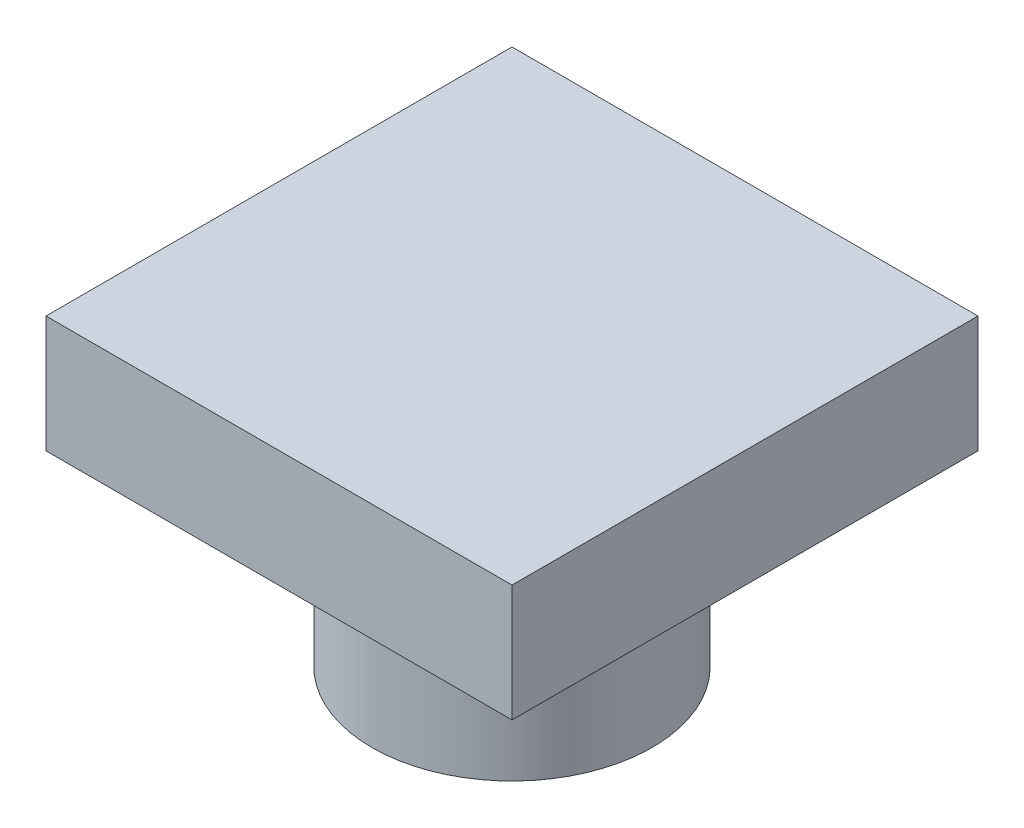
ISO-10303-21;
HEADER;
FILE_DESCRIPTION(('STEP AP214'),'2;1');
FILE_NAME('part.step','',(''),(''),'','','');
FILE_SCHEMA(('AUTOMOTIVE_DESIGN { 1 0 10303 214 1 1 1 1 }'));
ENDSEC;
DATA;
#1=APPLICATION_CONTEXT('core data for automotive mechanical design processes');
#2=APPLICATION_PROTOCOL_DEFINITION('international standard','automotive_design',2000,#1);
#3=PRODUCT_CONTEXT('',#1,'mechanical');
#4=PRODUCT('Part','Part','',(#3));
#5=PRODUCT_RELATED_PRODUCT_CATEGORY('part','',(#4));
#6=PRODUCT_DEFINITION_FORMATION('','',#4);
#7=PRODUCT_DEFINITION_CONTEXT('part definition',#1,'design');
#8=PRODUCT_DEFINITION('design','',#6,#7);
#9=PRODUCT_DEFINITION_SHAPE('','',#8);
#10=(LENGTH_UNIT() NAMED_UNIT(*) SI_UNIT(.MILLI.,.METRE.));
#11=(NAMED_UNIT(*) PLANE_ANGLE_UNIT() SI_UNIT($,.RADIAN.));
#12=(NAMED_UNIT(*) SI_UNIT($,.STERADIAN.) SOLID_ANGLE_UNIT());
#13=UNCERTAINTY_MEASURE_WITH_UNIT(LENGTH_MEASURE(1.E-05),#10,'distance_accuracy_value','');
#14=(GEOMETRIC_REPRESENTATION_CONTEXT(3) GLOBAL_UNCERTAINTY_ASSIGNED_CONTEXT((#13)) GLOBAL_UNIT_ASSIGNED_CONTEXT((#10,
#11,#12)) REPRESENTATION_CONTEXT('',''));
#15=CARTESIAN_POINT('',(0.,0.,0.));
#16=DIRECTION('',(0.,0.,1.));
#17=DIRECTION('',(1.,0.,0.));
#18=AXIS2_PLACEMENT_3D('',#15,#16,#17);
#19=CARTESIAN_POINT('',(0.,0.,0.));
#20=DIRECTION('',(0.,1.,0.));
#21=DIRECTION('',(0.,0.,1.));
#22=AXIS2_PLACEMENT_3D('',#19,#20,#21);
#23=PLANE('',#22);
#24=CARTESIAN_POINT('',(0.,0.,0.));
#25=DIRECTION('',(0.,-1.,0.));
#26=DIRECTION('',(0.,0.,-1.));
#27=AXIS2_PLACEMENT_3D('',#24,#25,#26);
#28=CIRCLE('',#27,4.);
#29=CARTESIAN_POINT('',(0.,0.,-4.));
#30=VERTEX_POINT('',#29);
#31=EDGE_CURVE('E144',#30,#30,#28,.T.);
#32=ORIENTED_EDGE('',*,*,#31,.F.);
#33=EDGE_LOOP('',(#32));
#34=FACE_BOUND('',#33,.T.);
#35=CARTESIAN_POINT('',(0.,0.,0.));
#36=DIRECTION('',(0.,-1.,0.));
#37=DIRECTION('',(0.,0.,-1.));
#38=AXIS2_PLACEMENT_3D('',#35,#36,#37);
#39=CIRCLE('',#38,6.);
#40=CARTESIAN_POINT('',(0.,0.,-6.));
#41=VERTEX_POINT('',#40);
#42=EDGE_CURVE('E11',#41,#41,#39,.T.);
#43=ORIENTED_EDGE('',*,*,#42,.T.);
#44=EDGE_LOOP('',(#43));
#45=FACE_BOUND('',#44,.T.);
#46=ADVANCED_FACE('F37',(#34,#45),#23,.F.);
#47=CARTESIAN_POINT('',(0.,0.,0.));
#48=DIRECTION('',(0.,-1.,0.));
#49=DIRECTION('',(0.,0.,-1.));
#50=AXIS2_PLACEMENT_3D('',#47,#48,#49);
#51=CYLINDRICAL_SURFACE('',#50,6.);
#52=ORIENTED_EDGE('',*,*,#42,.F.);
#53=EDGE_LOOP('',(#52));
#54=FACE_BOUND('',#53,.T.);
#55=CARTESIAN_POINT('',(0.,8.,0.));
#56=DIRECTION('',(0.,-1.,0.));
#57=DIRECTION('',(0.,0.,-1.));
#58=AXIS2_PLACEMENT_3D('',#55,#56,#57);
#59=CIRCLE('',#58,6.);
#60=CARTESIAN_POINT('',(0.,8.,-6.));
#61=VERTEX_POINT('',#60);
#62=EDGE_CURVE('E45',#61,#61,#59,.T.);
#63=ORIENTED_EDGE('',*,*,#62,.T.);
#64=EDGE_LOOP('',(#63));
#65=FACE_BOUND('',#64,.T.);
#66=ADVANCED_FACE('F119',(#54,#65),#51,.T.);
#67=CARTESIAN_POINT('',(-9.975,13.,9.975));
#68=DIRECTION('',(-1.,0.,0.));
#69=DIRECTION('',(0.,0.,1.));
#70=AXIS2_PLACEMENT_3D('',#67,#68,#69);
#71=PLANE('',#70);
#72=DIRECTION('',(0.,0.,-1.));
#73=VECTOR('',#72,1.);
#74=CARTESIAN_POINT('',(-9.975,8.,9.975));
#75=LINE('',#74,#73);
#76=CARTESIAN_POINT('',(-9.975,8.,9.975));
#77=VERTEX_POINT('',#76);
#78=CARTESIAN_POINT('',(-9.975,8.,-9.975));
#79=VERTEX_POINT('',#78);
#80=EDGE_CURVE('E106',#77,#79,#75,.T.);
#81=ORIENTED_EDGE('',*,*,#80,.F.);
#82=DIRECTION('',(0.,-1.,0.));
#83=VECTOR('',#82,1.);
#84=CARTESIAN_POINT('',(-9.975,13.,9.975));
#85=LINE('',#84,#83);
#86=CARTESIAN_POINT('',(-9.975,13.,9.975));
#87=VERTEX_POINT('',#86);
#88=EDGE_CURVE('E53',#87,#77,#85,.T.);
#89=ORIENTED_EDGE('',*,*,#88,.F.);
#90=DIRECTION('',(0.,0.,-1.));
#91=VECTOR('',#90,1.);
#92=CARTESIAN_POINT('',(-9.975,13.,9.975));
#93=LINE('',#92,#91);
#94=CARTESIAN_POINT('',(-9.975,13.,-9.975));
#95=VERTEX_POINT('',#94);
#96=EDGE_CURVE('E100',#87,#95,#93,.T.);
#97=ORIENTED_EDGE('',*,*,#96,.T.);
#98=DIRECTION('',(0.,-1.,0.));
#99=VECTOR('',#98,1.);
#100=CARTESIAN_POINT('',(-9.975,13.,-9.975));
#101=LINE('',#100,#99);
#102=EDGE_CURVE('E78',#95,#79,#101,.T.);
#103=ORIENTED_EDGE('',*,*,#102,.T.);
#104=EDGE_LOOP('',(#81,#89,#97,#103));
#105=FACE_BOUND('',#104,.T.);
#106=ADVANCED_FACE('F126',(#105),#71,.T.);
#107=CARTESIAN_POINT('',(-9.975,13.,9.975));
#108=DIRECTION('',(0.,0.,-1.));
#109=DIRECTION('',(-1.,0.,0.));
#110=AXIS2_PLACEMENT_3D('',#107,#108,#109);
#111=PLANE('',#110);
#112=DIRECTION('',(1.,0.,0.));
#113=VECTOR('',#112,1.);
#114=CARTESIAN_POINT('',(-9.975,8.,9.975));
#115=LINE('',#114,#113);
#116=CARTESIAN_POINT('',(9.975,8.,9.975));
#117=VERTEX_POINT('',#116);
#118=EDGE_CURVE('E70',#77,#117,#115,.T.);
#119=ORIENTED_EDGE('',*,*,#118,.T.);
#120=DIRECTION('',(0.,-1.,0.));
#121=VECTOR('',#120,1.);
#122=CARTESIAN_POINT('',(9.975,13.,9.975));
#123=LINE('',#122,#121);
#124=CARTESIAN_POINT('',(9.975,13.,9.975));
#125=VERTEX_POINT('',#124);
#126=EDGE_CURVE('E97',#125,#117,#123,.T.);
#127=ORIENTED_EDGE('',*,*,#126,.F.);
#128=DIRECTION('',(1.,0.,0.));
#129=VECTOR('',#128,1.);
#130=CARTESIAN_POINT('',(-9.975,13.,9.975));
#131=LINE('',#130,#129);
#132=EDGE_CURVE('E88',#87,#125,#131,.T.);
#133=ORIENTED_EDGE('',*,*,#132,.F.);
#134=ORIENTED_EDGE('',*,*,#88,.T.);
#135=EDGE_LOOP('',(#119,#127,#133,#134));
#136=FACE_BOUND('',#135,.T.);
#137=ADVANCED_FACE('F128',(#136),#111,.F.);
#138=CARTESIAN_POINT('',(9.975,13.,9.975));
#139=DIRECTION('',(-1.,0.,0.));
#140=DIRECTION('',(0.,0.,1.));
#141=AXIS2_PLACEMENT_3D('',#138,#139,#140);
#142=PLANE('',#141);
#143=DIRECTION('',(0.,0.,-1.));
#144=VECTOR('',#143,1.);
#145=CARTESIAN_POINT('',(9.975,8.,9.975));
#146=LINE('',#145,#144);
#147=CARTESIAN_POINT('',(9.975,8.,-9.975));
#148=VERTEX_POINT('',#147);
#149=EDGE_CURVE('E95',#117,#148,#146,.T.);
#150=ORIENTED_EDGE('',*,*,#149,.T.);
#151=DIRECTION('',(0.,-1.,0.));
#152=VECTOR('',#151,1.);
#153=CARTESIAN_POINT('',(9.975,13.,-9.975));
#154=LINE('',#153,#152);
#155=CARTESIAN_POINT('',(9.975,13.,-9.975));
#156=VERTEX_POINT('',#155);
#157=EDGE_CURVE('E92',#156,#148,#154,.T.);
#158=ORIENTED_EDGE('',*,*,#157,.F.);
#159=DIRECTION('',(0.,0.,-1.));
#160=VECTOR('',#159,1.);
#161=CARTESIAN_POINT('',(9.975,13.,9.975));
#162=LINE('',#161,#160);
#163=EDGE_CURVE('E83',#125,#156,#162,.T.);
#164=ORIENTED_EDGE('',*,*,#163,.F.);
#165=ORIENTED_EDGE('',*,*,#126,.T.);
#166=EDGE_LOOP('',(#150,#158,#164,#165));
#167=FACE_BOUND('',#166,.T.);
#168=ADVANCED_FACE('F93',(#167),#142,.F.);
#169=CARTESIAN_POINT('',(-9.975,13.,-9.975));
#170=DIRECTION('',(0.,0.,-1.));
#171=DIRECTION('',(-1.,0.,0.));
#172=AXIS2_PLACEMENT_3D('',#169,#170,#171);
#173=PLANE('',#172);
#174=DIRECTION('',(1.,0.,0.));
#175=VECTOR('',#174,1.);
#176=CARTESIAN_POINT('',(-9.975,8.,-9.975));
#177=LINE('',#176,#175);
#178=EDGE_CURVE('E109',#79,#148,#177,.T.);
#179=ORIENTED_EDGE('',*,*,#178,.F.);
#180=ORIENTED_EDGE('',*,*,#102,.F.);
#181=DIRECTION('',(1.,0.,0.));
#182=VECTOR('',#181,1.);
#183=CARTESIAN_POINT('',(-9.975,13.,-9.975));
#184=LINE('',#183,#182);
#185=EDGE_CURVE('E87',#95,#156,#184,.T.);
#186=ORIENTED_EDGE('',*,*,#185,.T.);
#187=ORIENTED_EDGE('',*,*,#157,.T.);
#188=EDGE_LOOP('',(#179,#180,#186,#187));
#189=FACE_BOUND('',#188,.T.);
#190=ADVANCED_FACE('F99',(#189),#173,.T.);
#191=CARTESIAN_POINT('',(0.,13.,0.));
#192=DIRECTION('',(0.,-1.,0.));
#193=DIRECTION('',(0.,0.,-1.));
#194=AXIS2_PLACEMENT_3D('',#191,#192,#193);
#195=PLANE('',#194);
#196=ORIENTED_EDGE('',*,*,#96,.F.);
#197=ORIENTED_EDGE('',*,*,#132,.T.);
#198=ORIENTED_EDGE('',*,*,#163,.T.);
#199=ORIENTED_EDGE('',*,*,#185,.F.);
#200=EDGE_LOOP('',(#196,#197,#198,#199));
#201=FACE_BOUND('',#200,.T.);
#202=ADVANCED_FACE('F86',(#201),#195,.F.);
#203=CARTESIAN_POINT('',(0.,8.,0.));
#204=DIRECTION('',(0.,-1.,0.));
#205=DIRECTION('',(0.,0.,-1.));
#206=AXIS2_PLACEMENT_3D('',#203,#204,#205);
#207=PLANE('',#206);
#208=ORIENTED_EDGE('',*,*,#62,.F.);
#209=EDGE_LOOP('',(#208));
#210=FACE_BOUND('',#209,.T.);
#211=ORIENTED_EDGE('',*,*,#80,.T.);
#212=ORIENTED_EDGE('',*,*,#178,.T.);
#213=ORIENTED_EDGE('',*,*,#149,.F.);
#214=ORIENTED_EDGE('',*,*,#118,.F.);
#215=EDGE_LOOP('',(#211,#212,#213,#214));
#216=FACE_BOUND('',#215,.T.);
#217=ADVANCED_FACE('F121',(#210,#216),#207,.T.);
#218=CARTESIAN_POINT('',(0.,10.5,0.));
#219=DIRECTION('',(0.,-1.,0.));
#220=DIRECTION('',(0.,0.,-1.));
#221=AXIS2_PLACEMENT_3D('',#218,#219,#220);
#222=CYLINDRICAL_SURFACE('',#221,4.);
#223=CARTESIAN_POINT('',(0.,10.5,0.));
#224=DIRECTION('',(0.,-1.,0.));
#225=DIRECTION('',(0.,0.,-1.));
#226=AXIS2_PLACEMENT_3D('',#223,#224,#225);
#227=CIRCLE('',#226,4.);
#228=CARTESIAN_POINT('',(0.,10.5,-4.));
#229=VERTEX_POINT('',#228);
#230=EDGE_CURVE('E110',#229,#229,#227,.T.);
#231=CARTESIAN_POINT('',(0.,10.5,-4.));
#232=CARTESIAN_POINT('',(0.,10.390625,-4.));
#233=CARTESIAN_POINT('',(0.,10.28125,-4.));
#234=CARTESIAN_POINT('',(0.,10.0625,-4.));
#235=CARTESIAN_POINT('',(0.,9.953125,-4.));
#236=CARTESIAN_POINT('',(0.,9.734375,-4.));
#237=CARTESIAN_POINT('',(0.,9.625,-4.));
#238=CARTESIAN_POINT('',(0.,9.40625,-4.));
#239=CARTESIAN_POINT('',(0.,9.296875,-4.));
#240=CARTESIAN_POINT('',(0.,9.078125,-4.));
#241=CARTESIAN_POINT('',(0.,8.96875,-4.));
#242=CARTESIAN_POINT('',(0.,8.75,-4.));
#243=CARTESIAN_POINT('',(0.,8.640625,-4.));
#244=CARTESIAN_POINT('',(0.,8.421875,-4.));
#245=CARTESIAN_POINT('',(0.,8.3125,-4.));
#246=CARTESIAN_POINT('',(0.,8.09375,-4.));
#247=CARTESIAN_POINT('',(0.,7.984375,-4.));
#248=CARTESIAN_POINT('',(0.,7.765625,-4.));
#249=CARTESIAN_POINT('',(0.,7.65625,-4.));
#250=CARTESIAN_POINT('',(0.,7.4375,-4.));
#251=CARTESIAN_POINT('',(0.,7.328125,-4.));
#252=CARTESIAN_POINT('',(0.,7.109375,-4.));
#253=CARTESIAN_POINT('',(0.,7.,-4.));
#254=CARTESIAN_POINT('',(0.,6.78125,-4.));
#255=CARTESIAN_POINT('',(0.,6.671875,-4.));
#256=CARTESIAN_POINT('',(0.,6.453125,-4.));
#257=CARTESIAN_POINT('',(0.,6.34375,-4.));
#258=CARTESIAN_POINT('',(0.,6.125,-4.));
#259=CARTESIAN_POINT('',(0.,6.015625,-4.));
#260=CARTESIAN_POINT('',(0.,5.796875,-4.));
#261=CARTESIAN_POINT('',(0.,5.6875,-4.));
#262=CARTESIAN_POINT('',(0.,5.46875,-4.));
#263=CARTESIAN_POINT('',(0.,5.359375,-4.));
#264=CARTESIAN_POINT('',(0.,5.140625,-4.));
#265=CARTESIAN_POINT('',(0.,5.03125,-4.));
#266=CARTESIAN_POINT('',(0.,4.8125,-4.));
#267=CARTESIAN_POINT('',(0.,4.703125,-4.));
#268=CARTESIAN_POINT('',(0.,4.484375,-4.));
#269=CARTESIAN_POINT('',(0.,4.375,-4.));
#270=CARTESIAN_POINT('',(0.,4.15625,-4.));
#271=CARTESIAN_POINT('',(0.,4.046875,-4.));
#272=CARTESIAN_POINT('',(0.,3.828125,-4.));
#273=CARTESIAN_POINT('',(0.,3.71875,-4.));
#274=CARTESIAN_POINT('',(0.,3.5,-4.));
#275=CARTESIAN_POINT('',(0.,3.390625,-4.));
#276=CARTESIAN_POINT('',(0.,3.171875,-4.));
#277=CARTESIAN_POINT('',(0.,3.0625,-4.));
#278=CARTESIAN_POINT('',(0.,2.84375,-4.));
#279=CARTESIAN_POINT('',(0.,2.734375,-4.));
#280=CARTESIAN_POINT('',(0.,2.515625,-4.));
#281=CARTESIAN_POINT('',(0.,2.40625,-4.));
#282=CARTESIAN_POINT('',(0.,2.1875,-4.));
#283=CARTESIAN_POINT('',(0.,2.078125,-4.));
#284=CARTESIAN_POINT('',(0.,1.859375,-4.));
#285=CARTESIAN_POINT('',(0.,1.75,-4.));
#286=CARTESIAN_POINT('',(0.,1.53125,-4.));
#287=CARTESIAN_POINT('',(0.,1.421875,-4.));
#288=CARTESIAN_POINT('',(0.,1.203125,-4.));
#289=CARTESIAN_POINT('',(0.,1.09375,-4.));
#290=CARTESIAN_POINT('',(0.,0.875000000000001,-4.));
#291=CARTESIAN_POINT('',(0.,0.765625000000001,-4.));
#292=CARTESIAN_POINT('',(0.,0.546875,-4.));
#293=CARTESIAN_POINT('',(0.,0.4375,-4.));
#294=CARTESIAN_POINT('',(0.,0.21875,-4.));
#295=CARTESIAN_POINT('',(0.,0.109375,-4.));
#296=CARTESIAN_POINT('',(0.,0.,-4.));
#297=B_SPLINE_CURVE_WITH_KNOTS('',3,(#231,#232,#233,#234,#235,#236,#237,#238,#239,#240,#241,
#242,#243,#244,#245,#246,#247,#248,#249,#250,#251,#252,#253,#254,#255,#256,#257,#258,#259,#260,
#261,#262,#263,#264,#265,#266,#267,#268,#269,#270,#271,#272,#273,#274,#275,#276,#277,#278,#279,
#280,#281,#282,#283,#284,#285,#286,#287,#288,#289,#290,#291,#292,#293,#294,#295,#296),
.UNSPECIFIED.,.F.,.F.,(4,2,2,2,2,2,2,2,2,2,2,2,2,2,2,2,2,2,2,2,2,2,2,2,2,2,2,2,2,2,2,2,4),(0.,
0.328124999999999,0.656249999999999,0.984374999999999,1.3125,1.640625,1.96875,2.296875,2.625,
2.953125,3.28125,3.609375,3.9375,4.265625,4.59375,4.921875,5.25,5.578125,5.90625,6.234375,
6.5625,6.890625,7.21875,7.546875,7.875,8.203125,8.53125,8.859375,9.1875,9.515625,9.84375,
10.171875,10.5),.UNSPECIFIED.);
#298=EDGE_CURVE('BSEAM124',#229,#30,#297,.T.);
#299=ORIENTED_EDGE('',*,*,#230,.F.);
#300=ORIENTED_EDGE('',*,*,#31,.T.);
#301=ORIENTED_EDGE('',*,*,#298,.T.);
#302=ORIENTED_EDGE('',*,*,#298,.F.);
#303=EDGE_LOOP('',(#299,#301,#300,#302));
#304=FACE_BOUND('',#303,.T.);
#305=ADVANCED_FACE('F124',(#304),#222,.F.);
#306=CARTESIAN_POINT('',(0.,10.5,0.));
#307=DIRECTION('',(0.,-1.,0.));
#308=DIRECTION('',(0.,0.,-1.));
#309=AXIS2_PLACEMENT_3D('',#306,#307,#308);
#310=PLANE('',#309);
#311=ORIENTED_EDGE('',*,*,#230,.T.);
#312=EDGE_LOOP('',(#311));
#313=FACE_BOUND('',#312,.T.);
#314=ADVANCED_FACE('F151',(#313),#310,.T.);
#315=CLOSED_SHELL('',(#46,#66,#106,#137,#168,#190,#202,#217,#305,#314));
#316=MANIFOLD_SOLID_BREP('B2',#315);
#317=ADVANCED_BREP_SHAPE_REPRESENTATION('',(#18,#316),#14);
#318=SHAPE_DEFINITION_REPRESENTATION(#9,#317);
ENDSEC;
END-ISO-10303-21;
